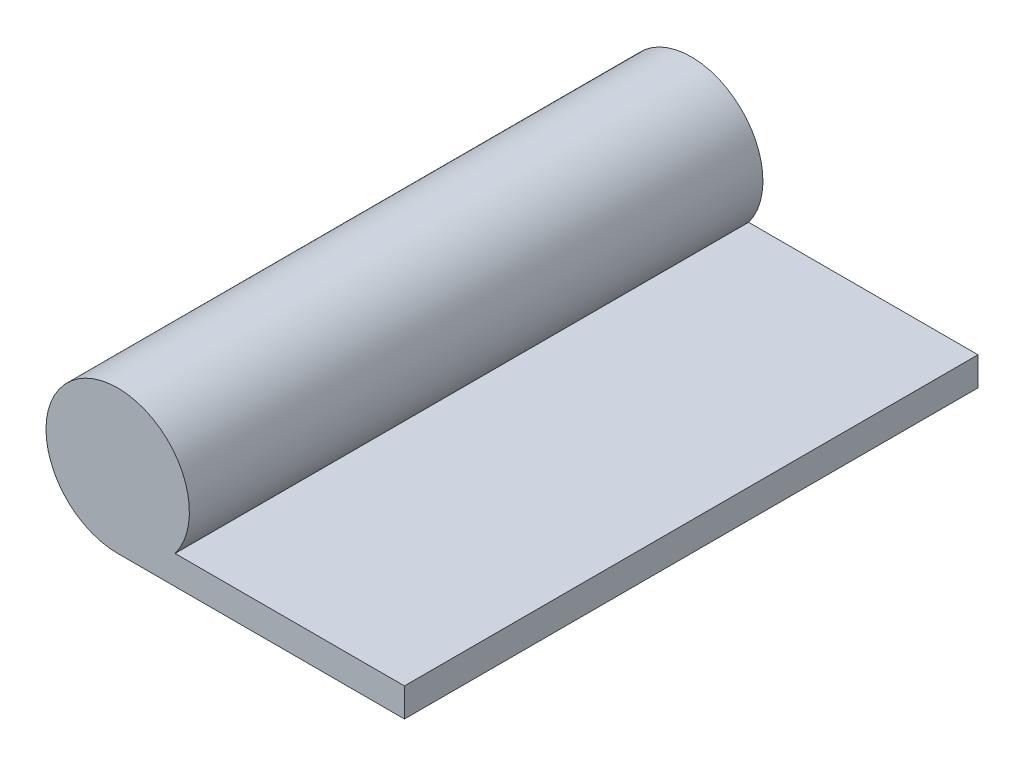
ISO-10303-21;
HEADER;
FILE_DESCRIPTION(('STEP AP214'),'2;1');
FILE_NAME('part.step','',(''),(''),'','','');
FILE_SCHEMA(('AUTOMOTIVE_DESIGN { 1 0 10303 214 1 1 1 1 }'));
ENDSEC;
DATA;
#1=APPLICATION_CONTEXT('core data for automotive mechanical design processes');
#2=APPLICATION_PROTOCOL_DEFINITION('international standard','automotive_design',2000,#1);
#3=PRODUCT_CONTEXT('',#1,'mechanical');
#4=PRODUCT('Part','Part','',(#3));
#5=PRODUCT_RELATED_PRODUCT_CATEGORY('part','',(#4));
#6=PRODUCT_DEFINITION_FORMATION('','',#4);
#7=PRODUCT_DEFINITION_CONTEXT('part definition',#1,'design');
#8=PRODUCT_DEFINITION('design','',#6,#7);
#9=PRODUCT_DEFINITION_SHAPE('','',#8);
#10=(LENGTH_UNIT() NAMED_UNIT(*) SI_UNIT(.MILLI.,.METRE.));
#11=(NAMED_UNIT(*) PLANE_ANGLE_UNIT() SI_UNIT($,.RADIAN.));
#12=(NAMED_UNIT(*) SI_UNIT($,.STERADIAN.) SOLID_ANGLE_UNIT());
#13=UNCERTAINTY_MEASURE_WITH_UNIT(LENGTH_MEASURE(1.E-05),#10,'distance_accuracy_value','');
#14=(GEOMETRIC_REPRESENTATION_CONTEXT(3) GLOBAL_UNCERTAINTY_ASSIGNED_CONTEXT((#13)) GLOBAL_UNIT_ASSIGNED_CONTEXT((#10,
#11,#12)) REPRESENTATION_CONTEXT('',''));
#15=CARTESIAN_POINT('',(0.,0.,0.));
#16=DIRECTION('',(0.,0.,1.));
#17=DIRECTION('',(1.,0.,0.));
#18=AXIS2_PLACEMENT_3D('',#15,#16,#17);
#19=CARTESIAN_POINT('',(0.,0.,100.));
#20=DIRECTION('',(0.,0.,-1.));
#21=DIRECTION('',(-1.,0.,0.));
#22=AXIS2_PLACEMENT_3D('',#19,#20,#21);
#23=CYLINDRICAL_SURFACE('',#22,12.5);
#24=CARTESIAN_POINT('',(0.,0.,0.));
#25=DIRECTION('',(0.,0.,1.));
#26=DIRECTION('',(1.,0.,0.));
#27=AXIS2_PLACEMENT_3D('',#24,#25,#26);
#28=CIRCLE('',#27,12.5);
#29=CARTESIAN_POINT('',(10.,-7.5,0.));
#30=VERTEX_POINT('',#29);
#31=CARTESIAN_POINT('',(0.,-12.5,0.));
#32=VERTEX_POINT('',#31);
#33=EDGE_CURVE('E96',#30,#32,#28,.T.);
#34=ORIENTED_EDGE('',*,*,#33,.T.);
#35=DIRECTION('',(0.,0.,-1.));
#36=VECTOR('',#35,1.);
#37=CARTESIAN_POINT('',(0.,-12.5,100.));
#38=LINE('',#37,#36);
#39=CARTESIAN_POINT('',(0.,-12.5,100.));
#40=VERTEX_POINT('',#39);
#41=EDGE_CURVE('E11',#40,#32,#38,.T.);
#42=ORIENTED_EDGE('',*,*,#41,.F.);
#43=CARTESIAN_POINT('',(0.,0.,100.));
#44=DIRECTION('',(0.,0.,1.));
#45=DIRECTION('',(1.,0.,0.));
#46=AXIS2_PLACEMENT_3D('',#43,#44,#45);
#47=CIRCLE('',#46,12.5);
#48=CARTESIAN_POINT('',(10.,-7.5,100.));
#49=VERTEX_POINT('',#48);
#50=EDGE_CURVE('E84',#49,#40,#47,.T.);
#51=ORIENTED_EDGE('',*,*,#50,.F.);
#52=DIRECTION('',(0.,0.,-1.));
#53=VECTOR('',#52,1.);
#54=CARTESIAN_POINT('',(10.,-7.5,100.));
#55=LINE('',#54,#53);
#56=EDGE_CURVE('E92',#49,#30,#55,.T.);
#57=ORIENTED_EDGE('',*,*,#56,.T.);
#58=EDGE_LOOP('',(#34,#42,#51,#57));
#59=FACE_BOUND('',#58,.T.);
#60=ADVANCED_FACE('F33',(#59),#23,.T.);
#61=CARTESIAN_POINT('',(0.,-12.5,100.));
#62=DIRECTION('',(0.,1.,0.));
#63=DIRECTION('',(0.,0.,1.));
#64=AXIS2_PLACEMENT_3D('',#61,#62,#63);
#65=PLANE('',#64);
#66=DIRECTION('',(1.,0.,0.));
#67=VECTOR('',#66,1.);
#68=CARTESIAN_POINT('',(0.,-12.5,0.));
#69=LINE('',#68,#67);
#70=CARTESIAN_POINT('',(50.,-12.5,0.));
#71=VERTEX_POINT('',#70);
#72=EDGE_CURVE('E88',#32,#71,#69,.T.);
#73=ORIENTED_EDGE('',*,*,#72,.T.);
#74=DIRECTION('',(0.,0.,-1.));
#75=VECTOR('',#74,1.);
#76=CARTESIAN_POINT('',(50.,-12.5,100.));
#77=LINE('',#76,#75);
#78=CARTESIAN_POINT('',(50.,-12.5,100.));
#79=VERTEX_POINT('',#78);
#80=EDGE_CURVE('E41',#79,#71,#77,.T.);
#81=ORIENTED_EDGE('',*,*,#80,.F.);
#82=DIRECTION('',(1.,0.,0.));
#83=VECTOR('',#82,1.);
#84=CARTESIAN_POINT('',(0.,-12.5,100.));
#85=LINE('',#84,#83);
#86=EDGE_CURVE('E79',#40,#79,#85,.T.);
#87=ORIENTED_EDGE('',*,*,#86,.F.);
#88=ORIENTED_EDGE('',*,*,#41,.T.);
#89=EDGE_LOOP('',(#73,#81,#87,#88));
#90=FACE_BOUND('',#89,.T.);
#91=ADVANCED_FACE('F87',(#90),#65,.F.);
#92=CARTESIAN_POINT('',(50.,-12.5,100.));
#93=DIRECTION('',(-1.,0.,0.));
#94=DIRECTION('',(0.,0.,1.));
#95=AXIS2_PLACEMENT_3D('',#92,#93,#94);
#96=PLANE('',#95);
#97=DIRECTION('',(0.,1.,0.));
#98=VECTOR('',#97,1.);
#99=CARTESIAN_POINT('',(50.,-12.5,0.));
#100=LINE('',#99,#98);
#101=CARTESIAN_POINT('',(50.,-7.5,0.));
#102=VERTEX_POINT('',#101);
#103=EDGE_CURVE('E66',#71,#102,#100,.T.);
#104=ORIENTED_EDGE('',*,*,#103,.T.);
#105=DIRECTION('',(0.,0.,-1.));
#106=VECTOR('',#105,1.);
#107=CARTESIAN_POINT('',(50.,-7.5,100.));
#108=LINE('',#107,#106);
#109=CARTESIAN_POINT('',(50.,-7.5,100.));
#110=VERTEX_POINT('',#109);
#111=EDGE_CURVE('E89',#110,#102,#108,.T.);
#112=ORIENTED_EDGE('',*,*,#111,.F.);
#113=DIRECTION('',(0.,1.,0.));
#114=VECTOR('',#113,1.);
#115=CARTESIAN_POINT('',(50.,-12.5,100.));
#116=LINE('',#115,#114);
#117=EDGE_CURVE('E82',#79,#110,#116,.T.);
#118=ORIENTED_EDGE('',*,*,#117,.F.);
#119=ORIENTED_EDGE('',*,*,#80,.T.);
#120=EDGE_LOOP('',(#104,#112,#118,#119));
#121=FACE_BOUND('',#120,.T.);
#122=ADVANCED_FACE('F90',(#121),#96,.F.);
#123=CARTESIAN_POINT('',(10.,-7.5,100.));
#124=DIRECTION('',(0.,-1.,0.));
#125=DIRECTION('',(0.,0.,-1.));
#126=AXIS2_PLACEMENT_3D('',#123,#124,#125);
#127=PLANE('',#126);
#128=DIRECTION('',(-1.,0.,0.));
#129=VECTOR('',#128,1.);
#130=CARTESIAN_POINT('',(10.,-7.5,0.));
#131=LINE('',#130,#129);
#132=EDGE_CURVE('E72',#102,#30,#131,.T.);
#133=ORIENTED_EDGE('',*,*,#132,.T.);
#134=ORIENTED_EDGE('',*,*,#56,.F.);
#135=DIRECTION('',(-1.,0.,0.));
#136=VECTOR('',#135,1.);
#137=CARTESIAN_POINT('',(10.,-7.5,100.));
#138=LINE('',#137,#136);
#139=EDGE_CURVE('E49',#110,#49,#138,.T.);
#140=ORIENTED_EDGE('',*,*,#139,.F.);
#141=ORIENTED_EDGE('',*,*,#111,.T.);
#142=EDGE_LOOP('',(#133,#134,#140,#141));
#143=FACE_BOUND('',#142,.T.);
#144=ADVANCED_FACE('F103',(#143),#127,.F.);
#145=CARTESIAN_POINT('',(0.,0.,100.));
#146=DIRECTION('',(0.,0.,1.));
#147=DIRECTION('',(1.,0.,0.));
#148=AXIS2_PLACEMENT_3D('',#145,#146,#147);
#149=PLANE('',#148);
#150=ORIENTED_EDGE('',*,*,#50,.T.);
#151=ORIENTED_EDGE('',*,*,#86,.T.);
#152=ORIENTED_EDGE('',*,*,#117,.T.);
#153=ORIENTED_EDGE('',*,*,#139,.T.);
#154=EDGE_LOOP('',(#150,#151,#152,#153));
#155=FACE_BOUND('',#154,.T.);
#156=ADVANCED_FACE('F80',(#155),#149,.T.);
#157=CARTESIAN_POINT('',(0.,0.,0.));
#158=DIRECTION('',(0.,0.,1.));
#159=DIRECTION('',(1.,0.,0.));
#160=AXIS2_PLACEMENT_3D('',#157,#158,#159);
#161=PLANE('',#160);
#162=ORIENTED_EDGE('',*,*,#33,.F.);
#163=ORIENTED_EDGE('',*,*,#132,.F.);
#164=ORIENTED_EDGE('',*,*,#103,.F.);
#165=ORIENTED_EDGE('',*,*,#72,.F.);
#166=EDGE_LOOP('',(#162,#163,#164,#165));
#167=FACE_BOUND('',#166,.T.);
#168=ADVANCED_FACE('F106',(#167),#161,.F.);
#169=CLOSED_SHELL('',(#60,#91,#122,#144,#156,#168));
#170=MANIFOLD_SOLID_BREP('B2',#169);
#171=ADVANCED_BREP_SHAPE_REPRESENTATION('',(#18,#170),#14);
#172=SHAPE_DEFINITION_REPRESENTATION(#9,#171);
ENDSEC;
END-ISO-10303-21;
